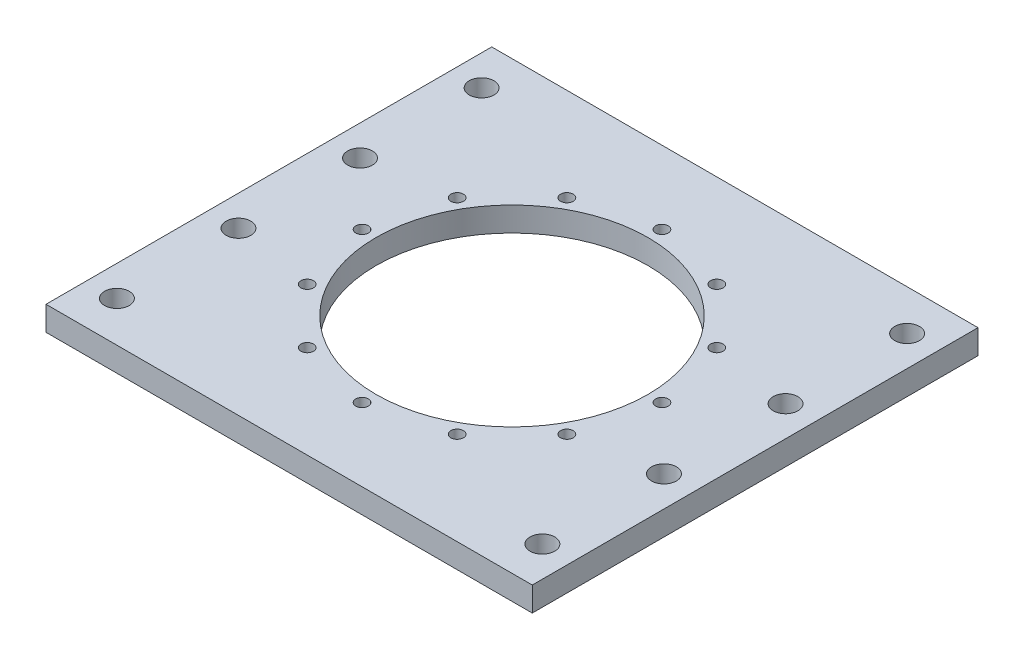
ISO-10303-21;
HEADER;
FILE_DESCRIPTION(('STEP AP214'),'2;1');
FILE_NAME('part.step','',(''),(''),'','','');
FILE_SCHEMA(('AUTOMOTIVE_DESIGN { 1 0 10303 214 1 1 1 1 }'));
ENDSEC;
DATA;
#1=APPLICATION_CONTEXT('core data for automotive mechanical design processes');
#2=APPLICATION_PROTOCOL_DEFINITION('international standard','automotive_design',2000,#1);
#3=PRODUCT_CONTEXT('',#1,'mechanical');
#4=PRODUCT('Part','Part','',(#3));
#5=PRODUCT_RELATED_PRODUCT_CATEGORY('part','',(#4));
#6=PRODUCT_DEFINITION_FORMATION('','',#4);
#7=PRODUCT_DEFINITION_CONTEXT('part definition',#1,'design');
#8=PRODUCT_DEFINITION('design','',#6,#7);
#9=PRODUCT_DEFINITION_SHAPE('','',#8);
#10=(LENGTH_UNIT() NAMED_UNIT(*) SI_UNIT(.MILLI.,.METRE.));
#11=(NAMED_UNIT(*) PLANE_ANGLE_UNIT() SI_UNIT($,.RADIAN.));
#12=(NAMED_UNIT(*) SI_UNIT($,.STERADIAN.) SOLID_ANGLE_UNIT());
#13=UNCERTAINTY_MEASURE_WITH_UNIT(LENGTH_MEASURE(1.E-05),#10,'distance_accuracy_value','');
#14=(GEOMETRIC_REPRESENTATION_CONTEXT(3) GLOBAL_UNCERTAINTY_ASSIGNED_CONTEXT((#13)) GLOBAL_UNIT_ASSIGNED_CONTEXT((#10,
#11,#12)) REPRESENTATION_CONTEXT('',''));
#15=CARTESIAN_POINT('',(0.,0.,0.));
#16=DIRECTION('',(0.,0.,1.));
#17=DIRECTION('',(1.,0.,0.));
#18=AXIS2_PLACEMENT_3D('',#15,#16,#17);
#19=CARTESIAN_POINT('',(60.,6.,-55.));
#20=DIRECTION('',(-1.,0.,0.));
#21=DIRECTION('',(0.,0.,1.));
#22=AXIS2_PLACEMENT_3D('',#19,#20,#21);
#23=PLANE('',#22);
#24=DIRECTION('',(0.,0.,-1.));
#25=VECTOR('',#24,1.);
#26=CARTESIAN_POINT('',(60.,0.,-55.));
#27=LINE('',#26,#25);
#28=CARTESIAN_POINT('',(60.,0.,55.));
#29=VERTEX_POINT('',#28);
#30=CARTESIAN_POINT('',(60.,0.,-55.));
#31=VERTEX_POINT('',#30);
#32=EDGE_CURVE('E104',#29,#31,#27,.T.);
#33=ORIENTED_EDGE('',*,*,#32,.T.);
#34=DIRECTION('',(0.,-1.,0.));
#35=VECTOR('',#34,1.);
#36=CARTESIAN_POINT('',(60.,6.,-55.));
#37=LINE('',#36,#35);
#38=CARTESIAN_POINT('',(60.,6.,-55.));
#39=VERTEX_POINT('',#38);
#40=EDGE_CURVE('E11',#39,#31,#37,.T.);
#41=ORIENTED_EDGE('',*,*,#40,.F.);
#42=DIRECTION('',(0.,0.,-1.));
#43=VECTOR('',#42,1.);
#44=CARTESIAN_POINT('',(60.,6.,-55.));
#45=LINE('',#44,#43);
#46=CARTESIAN_POINT('',(60.,6.,55.));
#47=VERTEX_POINT('',#46);
#48=EDGE_CURVE('E95',#47,#39,#45,.T.);
#49=ORIENTED_EDGE('',*,*,#48,.F.);
#50=DIRECTION('',(0.,-1.,0.));
#51=VECTOR('',#50,1.);
#52=CARTESIAN_POINT('',(60.,6.,55.));
#53=LINE('',#52,#51);
#54=EDGE_CURVE('E99',#47,#29,#53,.T.);
#55=ORIENTED_EDGE('',*,*,#54,.T.);
#56=EDGE_LOOP('',(#33,#41,#49,#55));
#57=FACE_BOUND('',#56,.T.);
#58=ADVANCED_FACE('F41',(#57),#23,.F.);
#59=CARTESIAN_POINT('',(-60.,6.,-55.));
#60=DIRECTION('',(0.,0.,1.));
#61=DIRECTION('',(1.,0.,0.));
#62=AXIS2_PLACEMENT_3D('',#59,#60,#61);
#63=PLANE('',#62);
#64=DIRECTION('',(-1.,0.,0.));
#65=VECTOR('',#64,1.);
#66=CARTESIAN_POINT('',(-60.,0.,-55.));
#67=LINE('',#66,#65);
#68=CARTESIAN_POINT('',(-60.,0.,-55.));
#69=VERTEX_POINT('',#68);
#70=EDGE_CURVE('E98',#31,#69,#67,.T.);
#71=ORIENTED_EDGE('',*,*,#70,.T.);
#72=DIRECTION('',(0.,-1.,0.));
#73=VECTOR('',#72,1.);
#74=CARTESIAN_POINT('',(-60.,6.,-55.));
#75=LINE('',#74,#73);
#76=CARTESIAN_POINT('',(-60.,6.,-55.));
#77=VERTEX_POINT('',#76);
#78=EDGE_CURVE('E47',#77,#69,#75,.T.);
#79=ORIENTED_EDGE('',*,*,#78,.F.);
#80=DIRECTION('',(-1.,0.,0.));
#81=VECTOR('',#80,1.);
#82=CARTESIAN_POINT('',(-60.,6.,-55.));
#83=LINE('',#82,#81);
#84=EDGE_CURVE('E90',#39,#77,#83,.T.);
#85=ORIENTED_EDGE('',*,*,#84,.F.);
#86=ORIENTED_EDGE('',*,*,#40,.T.);
#87=EDGE_LOOP('',(#71,#79,#85,#86));
#88=FACE_BOUND('',#87,.T.);
#89=ADVANCED_FACE('F91',(#88),#63,.F.);
#90=CARTESIAN_POINT('',(-60.,6.,-55.));
#91=DIRECTION('',(1.,0.,0.));
#92=DIRECTION('',(0.,0.,-1.));
#93=AXIS2_PLACEMENT_3D('',#90,#91,#92);
#94=PLANE('',#93);
#95=DIRECTION('',(0.,0.,1.));
#96=VECTOR('',#95,1.);
#97=CARTESIAN_POINT('',(-60.,0.,-55.));
#98=LINE('',#97,#96);
#99=CARTESIAN_POINT('',(-60.,0.,55.));
#100=VERTEX_POINT('',#99);
#101=EDGE_CURVE('E74',#69,#100,#98,.T.);
#102=ORIENTED_EDGE('',*,*,#101,.T.);
#103=DIRECTION('',(0.,-1.,0.));
#104=VECTOR('',#103,1.);
#105=CARTESIAN_POINT('',(-60.,6.,55.));
#106=LINE('',#105,#104);
#107=CARTESIAN_POINT('',(-60.,6.,55.));
#108=VERTEX_POINT('',#107);
#109=EDGE_CURVE('E97',#108,#100,#106,.T.);
#110=ORIENTED_EDGE('',*,*,#109,.F.);
#111=DIRECTION('',(0.,0.,1.));
#112=VECTOR('',#111,1.);
#113=CARTESIAN_POINT('',(-60.,6.,-55.));
#114=LINE('',#113,#112);
#115=EDGE_CURVE('E86',#77,#108,#114,.T.);
#116=ORIENTED_EDGE('',*,*,#115,.F.);
#117=ORIENTED_EDGE('',*,*,#78,.T.);
#118=EDGE_LOOP('',(#102,#110,#116,#117));
#119=FACE_BOUND('',#118,.T.);
#120=ADVANCED_FACE('F96',(#119),#94,.F.);
#121=CARTESIAN_POINT('',(-60.,6.,55.));
#122=DIRECTION('',(0.,0.,-1.));
#123=DIRECTION('',(-1.,0.,0.));
#124=AXIS2_PLACEMENT_3D('',#121,#122,#123);
#125=PLANE('',#124);
#126=DIRECTION('',(1.,0.,0.));
#127=VECTOR('',#126,1.);
#128=CARTESIAN_POINT('',(-60.,0.,55.));
#129=LINE('',#128,#127);
#130=EDGE_CURVE('E78',#100,#29,#129,.T.);
#131=ORIENTED_EDGE('',*,*,#130,.T.);
#132=ORIENTED_EDGE('',*,*,#54,.F.);
#133=DIRECTION('',(1.,0.,0.));
#134=VECTOR('',#133,1.);
#135=CARTESIAN_POINT('',(-60.,6.,55.));
#136=LINE('',#135,#134);
#137=EDGE_CURVE('E60',#108,#47,#136,.T.);
#138=ORIENTED_EDGE('',*,*,#137,.F.);
#139=ORIENTED_EDGE('',*,*,#109,.T.);
#140=EDGE_LOOP('',(#131,#132,#138,#139));
#141=FACE_BOUND('',#140,.T.);
#142=ADVANCED_FACE('F115',(#141),#125,.F.);
#143=CARTESIAN_POINT('',(0.,6.,0.));
#144=DIRECTION('',(0.,1.,0.));
#145=DIRECTION('',(0.,0.,1.));
#146=AXIS2_PLACEMENT_3D('',#143,#144,#145);
#147=PLANE('',#146);
#148=CARTESIAN_POINT('',(-52.5,6.,45.));
#149=DIRECTION('',(0.,1.,0.));
#150=DIRECTION('',(0.,0.,1.));
#151=AXIS2_PLACEMENT_3D('',#148,#149,#150);
#152=CIRCLE('',#151,3.05);
#153=CARTESIAN_POINT('',(-52.5,6.,48.05));
#154=VERTEX_POINT('',#153);
#155=EDGE_CURVE('E239',#154,#154,#152,.T.);
#156=ORIENTED_EDGE('',*,*,#155,.F.);
#157=EDGE_LOOP('',(#156));
#158=FACE_BOUND('',#157,.T.);
#159=CARTESIAN_POINT('',(-52.5,6.,15.));
#160=DIRECTION('',(0.,1.,0.));
#161=DIRECTION('',(0.,0.,1.));
#162=AXIS2_PLACEMENT_3D('',#159,#160,#161);
#163=CIRCLE('',#162,3.05);
#164=CARTESIAN_POINT('',(-52.5,6.,18.05));
#165=VERTEX_POINT('',#164);
#166=EDGE_CURVE('E234',#165,#165,#163,.T.);
#167=ORIENTED_EDGE('',*,*,#166,.F.);
#168=EDGE_LOOP('',(#167));
#169=FACE_BOUND('',#168,.T.);
#170=CARTESIAN_POINT('',(-52.5,6.,-15.));
#171=DIRECTION('',(0.,1.,0.));
#172=DIRECTION('',(0.,0.,1.));
#173=AXIS2_PLACEMENT_3D('',#170,#171,#172);
#174=CIRCLE('',#173,3.05);
#175=CARTESIAN_POINT('',(-52.5,6.,-11.95));
#176=VERTEX_POINT('',#175);
#177=EDGE_CURVE('E226',#176,#176,#174,.T.);
#178=ORIENTED_EDGE('',*,*,#177,.F.);
#179=EDGE_LOOP('',(#178));
#180=FACE_BOUND('',#179,.T.);
#181=CARTESIAN_POINT('',(-52.5,6.,-45.));
#182=DIRECTION('',(0.,1.,0.));
#183=DIRECTION('',(0.,0.,1.));
#184=AXIS2_PLACEMENT_3D('',#181,#182,#183);
#185=CIRCLE('',#184,3.05);
#186=CARTESIAN_POINT('',(-52.5,6.,-41.95));
#187=VERTEX_POINT('',#186);
#188=EDGE_CURVE('E225',#187,#187,#185,.T.);
#189=ORIENTED_EDGE('',*,*,#188,.F.);
#190=EDGE_LOOP('',(#189));
#191=FACE_BOUND('',#190,.T.);
#192=CARTESIAN_POINT('',(52.5,6.,45.));
#193=DIRECTION('',(0.,1.,0.));
#194=DIRECTION('',(0.,0.,1.));
#195=AXIS2_PLACEMENT_3D('',#192,#193,#194);
#196=CIRCLE('',#195,3.05);
#197=CARTESIAN_POINT('',(52.5,6.,48.05));
#198=VERTEX_POINT('',#197);
#199=EDGE_CURVE('E217',#198,#198,#196,.T.);
#200=ORIENTED_EDGE('',*,*,#199,.F.);
#201=EDGE_LOOP('',(#200));
#202=FACE_BOUND('',#201,.T.);
#203=CARTESIAN_POINT('',(52.5,6.,15.));
#204=DIRECTION('',(0.,1.,0.));
#205=DIRECTION('',(0.,0.,1.));
#206=AXIS2_PLACEMENT_3D('',#203,#204,#205);
#207=CIRCLE('',#206,3.05);
#208=CARTESIAN_POINT('',(52.5,6.,18.05));
#209=VERTEX_POINT('',#208);
#210=EDGE_CURVE('E208',#209,#209,#207,.T.);
#211=ORIENTED_EDGE('',*,*,#210,.F.);
#212=EDGE_LOOP('',(#211));
#213=FACE_BOUND('',#212,.T.);
#214=CARTESIAN_POINT('',(52.5,6.,-15.));
#215=DIRECTION('',(0.,1.,0.));
#216=DIRECTION('',(0.,0.,1.));
#217=AXIS2_PLACEMENT_3D('',#214,#215,#216);
#218=CIRCLE('',#217,3.05);
#219=CARTESIAN_POINT('',(52.5,6.,-11.95));
#220=VERTEX_POINT('',#219);
#221=EDGE_CURVE('E204',#220,#220,#218,.T.);
#222=ORIENTED_EDGE('',*,*,#221,.F.);
#223=EDGE_LOOP('',(#222));
#224=FACE_BOUND('',#223,.T.);
#225=CARTESIAN_POINT('',(52.5,6.,-45.));
#226=DIRECTION('',(0.,1.,0.));
#227=DIRECTION('',(0.,0.,1.));
#228=AXIS2_PLACEMENT_3D('',#225,#226,#227);
#229=CIRCLE('',#228,3.05);
#230=CARTESIAN_POINT('',(52.5,6.,-41.95));
#231=VERTEX_POINT('',#230);
#232=EDGE_CURVE('E198',#231,#231,#229,.T.);
#233=ORIENTED_EDGE('',*,*,#232,.F.);
#234=EDGE_LOOP('',(#233));
#235=FACE_BOUND('',#234,.T.);
#236=CARTESIAN_POINT('',(18.4999999999996,6.,-32.0429399400245));
#237=DIRECTION('',(0.,1.,0.));
#238=DIRECTION('',(0.,0.,1.));
#239=AXIS2_PLACEMENT_3D('',#236,#237,#238);
#240=CIRCLE('',#239,1.55);
#241=CARTESIAN_POINT('',(18.4999999999996,6.,-30.4929399400245));
#242=VERTEX_POINT('',#241);
#243=EDGE_CURVE('E191',#242,#242,#240,.T.);
#244=ORIENTED_EDGE('',*,*,#243,.F.);
#245=EDGE_LOOP('',(#244));
#246=FACE_BOUND('',#245,.T.);
#247=CARTESIAN_POINT('',(32.042939940024,6.,-18.5000000000004));
#248=DIRECTION('',(0.,1.,0.));
#249=DIRECTION('',(0.,0.,1.));
#250=AXIS2_PLACEMENT_3D('',#247,#248,#249);
#251=CIRCLE('',#250,1.55);
#252=CARTESIAN_POINT('',(32.042939940024,6.,-16.9500000000004));
#253=VERTEX_POINT('',#252);
#254=EDGE_CURVE('E187',#253,#253,#251,.T.);
#255=ORIENTED_EDGE('',*,*,#254,.F.);
#256=EDGE_LOOP('',(#255));
#257=FACE_BOUND('',#256,.T.);
#258=CARTESIAN_POINT('',(37.,6.,-3.87554428611588E-13));
#259=DIRECTION('',(0.,1.,0.));
#260=DIRECTION('',(0.,0.,1.));
#261=AXIS2_PLACEMENT_3D('',#258,#259,#260);
#262=CIRCLE('',#261,1.55);
#263=CARTESIAN_POINT('',(37.,6.,1.54999999999962));
#264=VERTEX_POINT('',#263);
#265=EDGE_CURVE('E179',#264,#264,#262,.T.);
#266=ORIENTED_EDGE('',*,*,#265,.F.);
#267=EDGE_LOOP('',(#266));
#268=FACE_BOUND('',#267,.T.);
#269=CARTESIAN_POINT('',(32.0429399400244,6.,18.4999999999997));
#270=DIRECTION('',(0.,1.,0.));
#271=DIRECTION('',(0.,0.,1.));
#272=AXIS2_PLACEMENT_3D('',#269,#270,#271);
#273=CIRCLE('',#272,1.55);
#274=CARTESIAN_POINT('',(32.0429399400244,6.,20.0499999999997));
#275=VERTEX_POINT('',#274);
#276=EDGE_CURVE('E172',#275,#275,#273,.T.);
#277=ORIENTED_EDGE('',*,*,#276,.F.);
#278=EDGE_LOOP('',(#277));
#279=FACE_BOUND('',#278,.T.);
#280=CARTESIAN_POINT('',(18.5000000000003,6.,32.0429399400241));
#281=DIRECTION('',(0.,1.,0.));
#282=DIRECTION('',(0.,0.,1.));
#283=AXIS2_PLACEMENT_3D('',#280,#281,#282);
#284=CIRCLE('',#283,1.55);
#285=CARTESIAN_POINT('',(18.5000000000003,6.,33.5929399400241));
#286=VERTEX_POINT('',#285);
#287=EDGE_CURVE('E166',#286,#286,#284,.T.);
#288=ORIENTED_EDGE('',*,*,#287,.F.);
#289=EDGE_LOOP('',(#288));
#290=FACE_BOUND('',#289,.T.);
#291=CARTESIAN_POINT('',(0.,6.,37.));
#292=DIRECTION('',(0.,1.,0.));
#293=DIRECTION('',(0.,0.,1.));
#294=AXIS2_PLACEMENT_3D('',#291,#292,#293);
#295=CIRCLE('',#294,1.55);
#296=CARTESIAN_POINT('',(0.,6.,38.55));
#297=VERTEX_POINT('',#296);
#298=EDGE_CURVE('E162',#297,#297,#295,.T.);
#299=ORIENTED_EDGE('',*,*,#298,.F.);
#300=EDGE_LOOP('',(#299));
#301=FACE_BOUND('',#300,.T.);
#302=CARTESIAN_POINT('',(-18.4999999999998,6.,32.0429399400243));
#303=DIRECTION('',(0.,1.,0.));
#304=DIRECTION('',(0.,0.,1.));
#305=AXIS2_PLACEMENT_3D('',#302,#303,#304);
#306=CIRCLE('',#305,1.55);
#307=CARTESIAN_POINT('',(-18.4999999999998,6.,33.5929399400243));
#308=VERTEX_POINT('',#307);
#309=EDGE_CURVE('E157',#308,#308,#306,.T.);
#310=ORIENTED_EDGE('',*,*,#309,.F.);
#311=EDGE_LOOP('',(#310));
#312=FACE_BOUND('',#311,.T.);
#313=CARTESIAN_POINT('',(-32.0429399400241,6.,18.5000000000002));
#314=DIRECTION('',(0.,1.,0.));
#315=DIRECTION('',(0.,0.,1.));
#316=AXIS2_PLACEMENT_3D('',#313,#314,#315);
#317=CIRCLE('',#316,1.55);
#318=CARTESIAN_POINT('',(-32.0429399400241,6.,20.0500000000001));
#319=VERTEX_POINT('',#318);
#320=EDGE_CURVE('E147',#319,#319,#317,.T.);
#321=ORIENTED_EDGE('',*,*,#320,.F.);
#322=EDGE_LOOP('',(#321));
#323=FACE_BOUND('',#322,.T.);
#324=CARTESIAN_POINT('',(-37.,6.,1.29184809537196E-13));
#325=DIRECTION('',(0.,1.,0.));
#326=DIRECTION('',(0.,0.,1.));
#327=AXIS2_PLACEMENT_3D('',#324,#325,#326);
#328=CIRCLE('',#327,1.55);
#329=CARTESIAN_POINT('',(-37.,6.,1.55000000000013));
#330=VERTEX_POINT('',#329);
#331=EDGE_CURVE('E144',#330,#330,#328,.T.);
#332=ORIENTED_EDGE('',*,*,#331,.F.);
#333=EDGE_LOOP('',(#332));
#334=FACE_BOUND('',#333,.T.);
#335=CARTESIAN_POINT('',(-32.0429399400243,6.,-18.4999999999999));
#336=DIRECTION('',(0.,1.,0.));
#337=DIRECTION('',(0.,0.,1.));
#338=AXIS2_PLACEMENT_3D('',#335,#336,#337);
#339=CIRCLE('',#338,1.55);
#340=CARTESIAN_POINT('',(-32.0429399400243,6.,-16.9499999999999));
#341=VERTEX_POINT('',#340);
#342=EDGE_CURVE('E138',#341,#341,#339,.T.);
#343=ORIENTED_EDGE('',*,*,#342,.F.);
#344=EDGE_LOOP('',(#343));
#345=FACE_BOUND('',#344,.T.);
#346=CARTESIAN_POINT('',(-18.5,6.,-32.0429399400242));
#347=DIRECTION('',(0.,1.,0.));
#348=DIRECTION('',(0.,0.,1.));
#349=AXIS2_PLACEMENT_3D('',#346,#347,#348);
#350=CIRCLE('',#349,1.55);
#351=CARTESIAN_POINT('',(-18.5,6.,-30.4929399400242));
#352=VERTEX_POINT('',#351);
#353=EDGE_CURVE('E135',#352,#352,#350,.T.);
#354=ORIENTED_EDGE('',*,*,#353,.F.);
#355=EDGE_LOOP('',(#354));
#356=FACE_BOUND('',#355,.T.);
#357=CARTESIAN_POINT('',(0.,6.,-37.));
#358=DIRECTION('',(0.,1.,0.));
#359=DIRECTION('',(0.,0.,1.));
#360=AXIS2_PLACEMENT_3D('',#357,#358,#359);
#361=CIRCLE('',#360,1.55);
#362=CARTESIAN_POINT('',(0.,6.,-35.45));
#363=VERTEX_POINT('',#362);
#364=EDGE_CURVE('E129',#363,#363,#361,.T.);
#365=ORIENTED_EDGE('',*,*,#364,.F.);
#366=EDGE_LOOP('',(#365));
#367=FACE_BOUND('',#366,.T.);
#368=CARTESIAN_POINT('',(0.,6.,0.));
#369=DIRECTION('',(0.,1.,0.));
#370=DIRECTION('',(0.,0.,1.));
#371=AXIS2_PLACEMENT_3D('',#368,#369,#370);
#372=CIRCLE('',#371,33.55);
#373=CARTESIAN_POINT('',(0.,6.,33.55));
#374=VERTEX_POINT('',#373);
#375=EDGE_CURVE('E117',#374,#374,#372,.T.);
#376=ORIENTED_EDGE('',*,*,#375,.F.);
#377=EDGE_LOOP('',(#376));
#378=FACE_BOUND('',#377,.T.);
#379=ORIENTED_EDGE('',*,*,#48,.T.);
#380=ORIENTED_EDGE('',*,*,#84,.T.);
#381=ORIENTED_EDGE('',*,*,#115,.T.);
#382=ORIENTED_EDGE('',*,*,#137,.T.);
#383=EDGE_LOOP('',(#379,#380,#381,#382));
#384=FACE_BOUND('',#383,.T.);
#385=ADVANCED_FACE('F88',(#158,#169,#180,#191,#202,#213,#224,#235,#246,#257,#268,#279,#290,#301,
#312,#323,#334,#345,#356,#367,#378,#384),#147,.T.);
#386=CARTESIAN_POINT('',(0.,0.,0.));
#387=DIRECTION('',(0.,1.,0.));
#388=DIRECTION('',(0.,0.,1.));
#389=AXIS2_PLACEMENT_3D('',#386,#387,#388);
#390=PLANE('',#389);
#391=CARTESIAN_POINT('',(-52.5,0.,45.));
#392=DIRECTION('',(0.,1.,0.));
#393=DIRECTION('',(0.,0.,1.));
#394=AXIS2_PLACEMENT_3D('',#391,#392,#393);
#395=CIRCLE('',#394,3.05);
#396=CARTESIAN_POINT('',(-52.5,0.,48.05));
#397=VERTEX_POINT('',#396);
#398=EDGE_CURVE('E240',#397,#397,#395,.T.);
#399=ORIENTED_EDGE('',*,*,#398,.T.);
#400=EDGE_LOOP('',(#399));
#401=FACE_BOUND('',#400,.T.);
#402=CARTESIAN_POINT('',(-52.5,0.,15.));
#403=DIRECTION('',(0.,1.,0.));
#404=DIRECTION('',(0.,0.,1.));
#405=AXIS2_PLACEMENT_3D('',#402,#403,#404);
#406=CIRCLE('',#405,3.05);
#407=CARTESIAN_POINT('',(-52.5,0.,18.05));
#408=VERTEX_POINT('',#407);
#409=EDGE_CURVE('E233',#408,#408,#406,.T.);
#410=ORIENTED_EDGE('',*,*,#409,.T.);
#411=EDGE_LOOP('',(#410));
#412=FACE_BOUND('',#411,.T.);
#413=CARTESIAN_POINT('',(-52.5,0.,-15.));
#414=DIRECTION('',(0.,1.,0.));
#415=DIRECTION('',(0.,0.,1.));
#416=AXIS2_PLACEMENT_3D('',#413,#414,#415);
#417=CIRCLE('',#416,3.05);
#418=CARTESIAN_POINT('',(-52.5,0.,-11.95));
#419=VERTEX_POINT('',#418);
#420=EDGE_CURVE('E221',#419,#419,#417,.T.);
#421=ORIENTED_EDGE('',*,*,#420,.T.);
#422=EDGE_LOOP('',(#421));
#423=FACE_BOUND('',#422,.T.);
#424=CARTESIAN_POINT('',(-52.5,0.,-45.));
#425=DIRECTION('',(0.,1.,0.));
#426=DIRECTION('',(0.,0.,1.));
#427=AXIS2_PLACEMENT_3D('',#424,#425,#426);
#428=CIRCLE('',#427,3.05);
#429=CARTESIAN_POINT('',(-52.5,0.,-41.95));
#430=VERTEX_POINT('',#429);
#431=EDGE_CURVE('E219',#430,#430,#428,.T.);
#432=ORIENTED_EDGE('',*,*,#431,.T.);
#433=EDGE_LOOP('',(#432));
#434=FACE_BOUND('',#433,.T.);
#435=CARTESIAN_POINT('',(52.5,0.,45.));
#436=DIRECTION('',(0.,1.,0.));
#437=DIRECTION('',(0.,0.,1.));
#438=AXIS2_PLACEMENT_3D('',#435,#436,#437);
#439=CIRCLE('',#438,3.05);
#440=CARTESIAN_POINT('',(52.5,0.,48.05));
#441=VERTEX_POINT('',#440);
#442=EDGE_CURVE('E215',#441,#441,#439,.T.);
#443=ORIENTED_EDGE('',*,*,#442,.T.);
#444=EDGE_LOOP('',(#443));
#445=FACE_BOUND('',#444,.T.);
#446=CARTESIAN_POINT('',(52.5,0.,15.));
#447=DIRECTION('',(0.,1.,0.));
#448=DIRECTION('',(0.,0.,1.));
#449=AXIS2_PLACEMENT_3D('',#446,#447,#448);
#450=CIRCLE('',#449,3.05);
#451=CARTESIAN_POINT('',(52.5,0.,18.05));
#452=VERTEX_POINT('',#451);
#453=EDGE_CURVE('E210',#452,#452,#450,.T.);
#454=ORIENTED_EDGE('',*,*,#453,.T.);
#455=EDGE_LOOP('',(#454));
#456=FACE_BOUND('',#455,.T.);
#457=CARTESIAN_POINT('',(52.5,0.,-15.));
#458=DIRECTION('',(0.,1.,0.));
#459=DIRECTION('',(0.,0.,1.));
#460=AXIS2_PLACEMENT_3D('',#457,#458,#459);
#461=CIRCLE('',#460,3.05);
#462=CARTESIAN_POINT('',(52.5,0.,-11.95));
#463=VERTEX_POINT('',#462);
#464=EDGE_CURVE('E202',#463,#463,#461,.T.);
#465=ORIENTED_EDGE('',*,*,#464,.T.);
#466=EDGE_LOOP('',(#465));
#467=FACE_BOUND('',#466,.T.);
#468=CARTESIAN_POINT('',(52.5,0.,-45.));
#469=DIRECTION('',(0.,1.,0.));
#470=DIRECTION('',(0.,0.,1.));
#471=AXIS2_PLACEMENT_3D('',#468,#469,#470);
#472=CIRCLE('',#471,3.05);
#473=CARTESIAN_POINT('',(52.5,0.,-41.95));
#474=VERTEX_POINT('',#473);
#475=EDGE_CURVE('E192',#474,#474,#472,.T.);
#476=ORIENTED_EDGE('',*,*,#475,.T.);
#477=EDGE_LOOP('',(#476));
#478=FACE_BOUND('',#477,.T.);
#479=CARTESIAN_POINT('',(18.4999999999996,0.,-32.0429399400245));
#480=DIRECTION('',(0.,1.,0.));
#481=DIRECTION('',(0.,0.,1.));
#482=AXIS2_PLACEMENT_3D('',#479,#480,#481);
#483=CIRCLE('',#482,1.55);
#484=CARTESIAN_POINT('',(18.4999999999996,0.,-30.4929399400245));
#485=VERTEX_POINT('',#484);
#486=EDGE_CURVE('E186',#485,#485,#483,.T.);
#487=ORIENTED_EDGE('',*,*,#486,.T.);
#488=EDGE_LOOP('',(#487));
#489=FACE_BOUND('',#488,.T.);
#490=CARTESIAN_POINT('',(32.042939940024,0.,-18.5000000000004));
#491=DIRECTION('',(0.,1.,0.));
#492=DIRECTION('',(0.,0.,1.));
#493=AXIS2_PLACEMENT_3D('',#490,#491,#492);
#494=CIRCLE('',#493,1.55);
#495=CARTESIAN_POINT('',(32.042939940024,0.,-16.9500000000004));
#496=VERTEX_POINT('',#495);
#497=EDGE_CURVE('E182',#496,#496,#494,.T.);
#498=ORIENTED_EDGE('',*,*,#497,.T.);
#499=EDGE_LOOP('',(#498));
#500=FACE_BOUND('',#499,.T.);
#501=CARTESIAN_POINT('',(37.,0.,-3.87554428611588E-13));
#502=DIRECTION('',(0.,1.,0.));
#503=DIRECTION('',(0.,0.,1.));
#504=AXIS2_PLACEMENT_3D('',#501,#502,#503);
#505=CIRCLE('',#504,1.55);
#506=CARTESIAN_POINT('',(37.,0.,1.54999999999961));
#507=VERTEX_POINT('',#506);
#508=EDGE_CURVE('E180',#507,#507,#505,.T.);
#509=ORIENTED_EDGE('',*,*,#508,.T.);
#510=EDGE_LOOP('',(#509));
#511=FACE_BOUND('',#510,.T.);
#512=CARTESIAN_POINT('',(32.0429399400244,0.,18.4999999999997));
#513=DIRECTION('',(0.,1.,0.));
#514=DIRECTION('',(0.,0.,1.));
#515=AXIS2_PLACEMENT_3D('',#512,#513,#514);
#516=CIRCLE('',#515,1.55);
#517=CARTESIAN_POINT('',(32.0429399400244,0.,20.0499999999997));
#518=VERTEX_POINT('',#517);
#519=EDGE_CURVE('E171',#518,#518,#516,.T.);
#520=ORIENTED_EDGE('',*,*,#519,.T.);
#521=EDGE_LOOP('',(#520));
#522=FACE_BOUND('',#521,.T.);
#523=CARTESIAN_POINT('',(18.5000000000003,0.,32.0429399400241));
#524=DIRECTION('',(0.,1.,0.));
#525=DIRECTION('',(0.,0.,1.));
#526=AXIS2_PLACEMENT_3D('',#523,#524,#525);
#527=CIRCLE('',#526,1.55);
#528=CARTESIAN_POINT('',(18.5000000000003,0.,33.5929399400241));
#529=VERTEX_POINT('',#528);
#530=EDGE_CURVE('E164',#529,#529,#527,.T.);
#531=ORIENTED_EDGE('',*,*,#530,.T.);
#532=EDGE_LOOP('',(#531));
#533=FACE_BOUND('',#532,.T.);
#534=CARTESIAN_POINT('',(0.,0.,37.));
#535=DIRECTION('',(0.,1.,0.));
#536=DIRECTION('',(0.,0.,1.));
#537=AXIS2_PLACEMENT_3D('',#534,#535,#536);
#538=CIRCLE('',#537,1.55);
#539=CARTESIAN_POINT('',(0.,0.,38.55));
#540=VERTEX_POINT('',#539);
#541=EDGE_CURVE('E159',#540,#540,#538,.T.);
#542=ORIENTED_EDGE('',*,*,#541,.T.);
#543=EDGE_LOOP('',(#542));
#544=FACE_BOUND('',#543,.T.);
#545=CARTESIAN_POINT('',(-18.4999999999998,0.,32.0429399400243));
#546=DIRECTION('',(0.,1.,0.));
#547=DIRECTION('',(0.,0.,1.));
#548=AXIS2_PLACEMENT_3D('',#545,#546,#547);
#549=CIRCLE('',#548,1.55);
#550=CARTESIAN_POINT('',(-18.4999999999998,0.,33.5929399400243));
#551=VERTEX_POINT('',#550);
#552=EDGE_CURVE('E153',#551,#551,#549,.T.);
#553=ORIENTED_EDGE('',*,*,#552,.T.);
#554=EDGE_LOOP('',(#553));
#555=FACE_BOUND('',#554,.T.);
#556=CARTESIAN_POINT('',(-32.0429399400241,0.,18.5000000000002));
#557=DIRECTION('',(0.,1.,0.));
#558=DIRECTION('',(0.,0.,1.));
#559=AXIS2_PLACEMENT_3D('',#556,#557,#558);
#560=CIRCLE('',#559,1.55);
#561=CARTESIAN_POINT('',(-32.0429399400241,0.,20.0500000000001));
#562=VERTEX_POINT('',#561);
#563=EDGE_CURVE('E146',#562,#562,#560,.T.);
#564=ORIENTED_EDGE('',*,*,#563,.T.);
#565=EDGE_LOOP('',(#564));
#566=FACE_BOUND('',#565,.T.);
#567=CARTESIAN_POINT('',(-37.,0.,1.29184809537196E-13));
#568=DIRECTION('',(0.,1.,0.));
#569=DIRECTION('',(0.,0.,1.));
#570=AXIS2_PLACEMENT_3D('',#567,#568,#569);
#571=CIRCLE('',#570,1.55);
#572=CARTESIAN_POINT('',(-37.,0.,1.55000000000013));
#573=VERTEX_POINT('',#572);
#574=EDGE_CURVE('E142',#573,#573,#571,.T.);
#575=ORIENTED_EDGE('',*,*,#574,.T.);
#576=EDGE_LOOP('',(#575));
#577=FACE_BOUND('',#576,.T.);
#578=CARTESIAN_POINT('',(-32.0429399400243,0.,-18.4999999999999));
#579=DIRECTION('',(0.,1.,0.));
#580=DIRECTION('',(0.,0.,1.));
#581=AXIS2_PLACEMENT_3D('',#578,#579,#580);
#582=CIRCLE('',#581,1.55);
#583=CARTESIAN_POINT('',(-32.0429399400243,0.,-16.9499999999999));
#584=VERTEX_POINT('',#583);
#585=EDGE_CURVE('E131',#584,#584,#582,.T.);
#586=ORIENTED_EDGE('',*,*,#585,.T.);
#587=EDGE_LOOP('',(#586));
#588=FACE_BOUND('',#587,.T.);
#589=CARTESIAN_POINT('',(-18.5,0.,-32.0429399400242));
#590=DIRECTION('',(0.,1.,0.));
#591=DIRECTION('',(0.,0.,1.));
#592=AXIS2_PLACEMENT_3D('',#589,#590,#591);
#593=CIRCLE('',#592,1.55);
#594=CARTESIAN_POINT('',(-18.5,0.,-30.4929399400242));
#595=VERTEX_POINT('',#594);
#596=EDGE_CURVE('E128',#595,#595,#593,.T.);
#597=ORIENTED_EDGE('',*,*,#596,.T.);
#598=EDGE_LOOP('',(#597));
#599=FACE_BOUND('',#598,.T.);
#600=CARTESIAN_POINT('',(0.,0.,-37.));
#601=DIRECTION('',(0.,1.,0.));
#602=DIRECTION('',(0.,0.,1.));
#603=AXIS2_PLACEMENT_3D('',#600,#601,#602);
#604=CIRCLE('',#603,1.55);
#605=CARTESIAN_POINT('',(0.,0.,-35.45));
#606=VERTEX_POINT('',#605);
#607=EDGE_CURVE('E122',#606,#606,#604,.T.);
#608=ORIENTED_EDGE('',*,*,#607,.T.);
#609=EDGE_LOOP('',(#608));
#610=FACE_BOUND('',#609,.T.);
#611=CARTESIAN_POINT('',(0.,0.,0.));
#612=DIRECTION('',(0.,1.,0.));
#613=DIRECTION('',(0.,0.,1.));
#614=AXIS2_PLACEMENT_3D('',#611,#612,#613);
#615=CIRCLE('',#614,33.55);
#616=CARTESIAN_POINT('',(0.,0.,33.55));
#617=VERTEX_POINT('',#616);
#618=EDGE_CURVE('E110',#617,#617,#615,.T.);
#619=ORIENTED_EDGE('',*,*,#618,.T.);
#620=EDGE_LOOP('',(#619));
#621=FACE_BOUND('',#620,.T.);
#622=ORIENTED_EDGE('',*,*,#32,.F.);
#623=ORIENTED_EDGE('',*,*,#130,.F.);
#624=ORIENTED_EDGE('',*,*,#101,.F.);
#625=ORIENTED_EDGE('',*,*,#70,.F.);
#626=EDGE_LOOP('',(#622,#623,#624,#625));
#627=FACE_BOUND('',#626,.T.);
#628=ADVANCED_FACE('F114',(#401,#412,#423,#434,#445,#456,#467,#478,#489,#500,#511,#522,#533,
#544,#555,#566,#577,#588,#599,#610,#621,#627),#390,.F.);
#629=CARTESIAN_POINT('',(0.,0.,0.));
#630=DIRECTION('',(0.,1.,0.));
#631=DIRECTION('',(0.,0.,1.));
#632=AXIS2_PLACEMENT_3D('',#629,#630,#631);
#633=CYLINDRICAL_SURFACE('',#632,33.55);
#634=ORIENTED_EDGE('',*,*,#618,.F.);
#635=EDGE_LOOP('',(#634));
#636=FACE_BOUND('',#635,.T.);
#637=ORIENTED_EDGE('',*,*,#375,.T.);
#638=EDGE_LOOP('',(#637));
#639=FACE_BOUND('',#638,.T.);
#640=ADVANCED_FACE('F289',(#636,#639),#633,.F.);
#641=CARTESIAN_POINT('',(0.,6.,-37.));
#642=DIRECTION('',(0.,1.,0.));
#643=DIRECTION('',(0.,0.,1.));
#644=AXIS2_PLACEMENT_3D('',#641,#642,#643);
#645=CYLINDRICAL_SURFACE('',#644,1.55);
#646=ORIENTED_EDGE('',*,*,#607,.F.);
#647=EDGE_LOOP('',(#646));
#648=FACE_BOUND('',#647,.T.);
#649=ORIENTED_EDGE('',*,*,#364,.T.);
#650=EDGE_LOOP('',(#649));
#651=FACE_BOUND('',#650,.T.);
#652=ADVANCED_FACE('F293',(#648,#651),#645,.F.);
#653=CARTESIAN_POINT('',(-18.5,6.,-32.0429399400242));
#654=DIRECTION('',(0.,1.,0.));
#655=DIRECTION('',(0.,0.,1.));
#656=AXIS2_PLACEMENT_3D('',#653,#654,#655);
#657=CYLINDRICAL_SURFACE('',#656,1.55);
#658=ORIENTED_EDGE('',*,*,#596,.F.);
#659=EDGE_LOOP('',(#658));
#660=FACE_BOUND('',#659,.T.);
#661=ORIENTED_EDGE('',*,*,#353,.T.);
#662=EDGE_LOOP('',(#661));
#663=FACE_BOUND('',#662,.T.);
#664=ADVANCED_FACE('F296',(#660,#663),#657,.F.);
#665=CARTESIAN_POINT('',(-32.0429399400243,6.,-18.4999999999999));
#666=DIRECTION('',(0.,1.,0.));
#667=DIRECTION('',(0.,0.,1.));
#668=AXIS2_PLACEMENT_3D('',#665,#666,#667);
#669=CYLINDRICAL_SURFACE('',#668,1.55);
#670=ORIENTED_EDGE('',*,*,#585,.F.);
#671=EDGE_LOOP('',(#670));
#672=FACE_BOUND('',#671,.T.);
#673=ORIENTED_EDGE('',*,*,#342,.T.);
#674=EDGE_LOOP('',(#673));
#675=FACE_BOUND('',#674,.T.);
#676=ADVANCED_FACE('F356',(#672,#675),#669,.F.);
#677=CARTESIAN_POINT('',(-37.,6.,1.29184809537196E-13));
#678=DIRECTION('',(0.,1.,0.));
#679=DIRECTION('',(0.,0.,1.));
#680=AXIS2_PLACEMENT_3D('',#677,#678,#679);
#681=CYLINDRICAL_SURFACE('',#680,1.55);
#682=ORIENTED_EDGE('',*,*,#574,.F.);
#683=EDGE_LOOP('',(#682));
#684=FACE_BOUND('',#683,.T.);
#685=ORIENTED_EDGE('',*,*,#331,.T.);
#686=EDGE_LOOP('',(#685));
#687=FACE_BOUND('',#686,.T.);
#688=ADVANCED_FACE('F370',(#684,#687),#681,.F.);
#689=CARTESIAN_POINT('',(-32.0429399400241,6.,18.5000000000002));
#690=DIRECTION('',(0.,1.,0.));
#691=DIRECTION('',(0.,0.,1.));
#692=AXIS2_PLACEMENT_3D('',#689,#690,#691);
#693=CYLINDRICAL_SURFACE('',#692,1.55);
#694=ORIENTED_EDGE('',*,*,#563,.F.);
#695=EDGE_LOOP('',(#694));
#696=FACE_BOUND('',#695,.T.);
#697=ORIENTED_EDGE('',*,*,#320,.T.);
#698=EDGE_LOOP('',(#697));
#699=FACE_BOUND('',#698,.T.);
#700=ADVANCED_FACE('F376',(#696,#699),#693,.F.);
#701=CARTESIAN_POINT('',(-18.4999999999998,6.,32.0429399400243));
#702=DIRECTION('',(0.,1.,0.));
#703=DIRECTION('',(0.,0.,1.));
#704=AXIS2_PLACEMENT_3D('',#701,#702,#703);
#705=CYLINDRICAL_SURFACE('',#704,1.55);
#706=ORIENTED_EDGE('',*,*,#552,.F.);
#707=EDGE_LOOP('',(#706));
#708=FACE_BOUND('',#707,.T.);
#709=ORIENTED_EDGE('',*,*,#309,.T.);
#710=EDGE_LOOP('',(#709));
#711=FACE_BOUND('',#710,.T.);
#712=ADVANCED_FACE('F383',(#708,#711),#705,.F.);
#713=CARTESIAN_POINT('',(0.,6.,37.));
#714=DIRECTION('',(0.,1.,0.));
#715=DIRECTION('',(0.,0.,1.));
#716=AXIS2_PLACEMENT_3D('',#713,#714,#715);
#717=CYLINDRICAL_SURFACE('',#716,1.55);
#718=ORIENTED_EDGE('',*,*,#541,.F.);
#719=EDGE_LOOP('',(#718));
#720=FACE_BOUND('',#719,.T.);
#721=ORIENTED_EDGE('',*,*,#298,.T.);
#722=EDGE_LOOP('',(#721));
#723=FACE_BOUND('',#722,.T.);
#724=ADVANCED_FACE('F394',(#720,#723),#717,.F.);
#725=CARTESIAN_POINT('',(18.5000000000003,6.,32.0429399400241));
#726=DIRECTION('',(0.,1.,0.));
#727=DIRECTION('',(0.,0.,1.));
#728=AXIS2_PLACEMENT_3D('',#725,#726,#727);
#729=CYLINDRICAL_SURFACE('',#728,1.55);
#730=ORIENTED_EDGE('',*,*,#530,.F.);
#731=EDGE_LOOP('',(#730));
#732=FACE_BOUND('',#731,.T.);
#733=ORIENTED_EDGE('',*,*,#287,.T.);
#734=EDGE_LOOP('',(#733));
#735=FACE_BOUND('',#734,.T.);
#736=ADVANCED_FACE('F401',(#732,#735),#729,.F.);
#737=CARTESIAN_POINT('',(32.0429399400244,6.,18.4999999999997));
#738=DIRECTION('',(0.,1.,0.));
#739=DIRECTION('',(0.,0.,1.));
#740=AXIS2_PLACEMENT_3D('',#737,#738,#739);
#741=CYLINDRICAL_SURFACE('',#740,1.55);
#742=ORIENTED_EDGE('',*,*,#519,.F.);
#743=EDGE_LOOP('',(#742));
#744=FACE_BOUND('',#743,.T.);
#745=ORIENTED_EDGE('',*,*,#276,.T.);
#746=EDGE_LOOP('',(#745));
#747=FACE_BOUND('',#746,.T.);
#748=ADVANCED_FACE('F415',(#744,#747),#741,.F.);
#749=CARTESIAN_POINT('',(37.,6.,-3.87554428611588E-13));
#750=DIRECTION('',(0.,1.,0.));
#751=DIRECTION('',(0.,0.,1.));
#752=AXIS2_PLACEMENT_3D('',#749,#750,#751);
#753=CYLINDRICAL_SURFACE('',#752,1.55);
#754=ORIENTED_EDGE('',*,*,#508,.F.);
#755=EDGE_LOOP('',(#754));
#756=FACE_BOUND('',#755,.T.);
#757=ORIENTED_EDGE('',*,*,#265,.T.);
#758=EDGE_LOOP('',(#757));
#759=FACE_BOUND('',#758,.T.);
#760=ADVANCED_FACE('F423',(#756,#759),#753,.F.);
#761=CARTESIAN_POINT('',(32.042939940024,6.,-18.5000000000004));
#762=DIRECTION('',(0.,1.,0.));
#763=DIRECTION('',(0.,0.,1.));
#764=AXIS2_PLACEMENT_3D('',#761,#762,#763);
#765=CYLINDRICAL_SURFACE('',#764,1.55);
#766=ORIENTED_EDGE('',*,*,#497,.F.);
#767=EDGE_LOOP('',(#766));
#768=FACE_BOUND('',#767,.T.);
#769=ORIENTED_EDGE('',*,*,#254,.T.);
#770=EDGE_LOOP('',(#769));
#771=FACE_BOUND('',#770,.T.);
#772=ADVANCED_FACE('F427',(#768,#771),#765,.F.);
#773=CARTESIAN_POINT('',(18.4999999999996,6.,-32.0429399400245));
#774=DIRECTION('',(0.,1.,0.));
#775=DIRECTION('',(0.,0.,1.));
#776=AXIS2_PLACEMENT_3D('',#773,#774,#775);
#777=CYLINDRICAL_SURFACE('',#776,1.55);
#778=ORIENTED_EDGE('',*,*,#486,.F.);
#779=EDGE_LOOP('',(#778));
#780=FACE_BOUND('',#779,.T.);
#781=ORIENTED_EDGE('',*,*,#243,.T.);
#782=EDGE_LOOP('',(#781));
#783=FACE_BOUND('',#782,.T.);
#784=ADVANCED_FACE('F437',(#780,#783),#777,.F.);
#785=CARTESIAN_POINT('',(52.5,6.,-45.));
#786=DIRECTION('',(0.,1.,0.));
#787=DIRECTION('',(0.,0.,1.));
#788=AXIS2_PLACEMENT_3D('',#785,#786,#787);
#789=CYLINDRICAL_SURFACE('',#788,3.05);
#790=ORIENTED_EDGE('',*,*,#475,.F.);
#791=EDGE_LOOP('',(#790));
#792=FACE_BOUND('',#791,.T.);
#793=ORIENTED_EDGE('',*,*,#232,.T.);
#794=EDGE_LOOP('',(#793));
#795=FACE_BOUND('',#794,.T.);
#796=ADVANCED_FACE('F449',(#792,#795),#789,.F.);
#797=CARTESIAN_POINT('',(52.5,6.,-15.));
#798=DIRECTION('',(0.,1.,0.));
#799=DIRECTION('',(0.,0.,1.));
#800=AXIS2_PLACEMENT_3D('',#797,#798,#799);
#801=CYLINDRICAL_SURFACE('',#800,3.05);
#802=ORIENTED_EDGE('',*,*,#464,.F.);
#803=EDGE_LOOP('',(#802));
#804=FACE_BOUND('',#803,.T.);
#805=ORIENTED_EDGE('',*,*,#221,.T.);
#806=EDGE_LOOP('',(#805));
#807=FACE_BOUND('',#806,.T.);
#808=ADVANCED_FACE('F460',(#804,#807),#801,.F.);
#809=CARTESIAN_POINT('',(52.5,6.,15.));
#810=DIRECTION('',(0.,1.,0.));
#811=DIRECTION('',(0.,0.,1.));
#812=AXIS2_PLACEMENT_3D('',#809,#810,#811);
#813=CYLINDRICAL_SURFACE('',#812,3.05);
#814=ORIENTED_EDGE('',*,*,#453,.F.);
#815=EDGE_LOOP('',(#814));
#816=FACE_BOUND('',#815,.T.);
#817=ORIENTED_EDGE('',*,*,#210,.T.);
#818=EDGE_LOOP('',(#817));
#819=FACE_BOUND('',#818,.T.);
#820=ADVANCED_FACE('F467',(#816,#819),#813,.F.);
#821=CARTESIAN_POINT('',(52.5,6.,45.));
#822=DIRECTION('',(0.,1.,0.));
#823=DIRECTION('',(0.,0.,1.));
#824=AXIS2_PLACEMENT_3D('',#821,#822,#823);
#825=CYLINDRICAL_SURFACE('',#824,3.05);
#826=ORIENTED_EDGE('',*,*,#442,.F.);
#827=EDGE_LOOP('',(#826));
#828=FACE_BOUND('',#827,.T.);
#829=ORIENTED_EDGE('',*,*,#199,.T.);
#830=EDGE_LOOP('',(#829));
#831=FACE_BOUND('',#830,.T.);
#832=ADVANCED_FACE('F472',(#828,#831),#825,.F.);
#833=CARTESIAN_POINT('',(-52.5,6.,-45.));
#834=DIRECTION('',(0.,1.,0.));
#835=DIRECTION('',(0.,0.,1.));
#836=AXIS2_PLACEMENT_3D('',#833,#834,#835);
#837=CYLINDRICAL_SURFACE('',#836,3.05);
#838=ORIENTED_EDGE('',*,*,#431,.F.);
#839=EDGE_LOOP('',(#838));
#840=FACE_BOUND('',#839,.T.);
#841=ORIENTED_EDGE('',*,*,#188,.T.);
#842=EDGE_LOOP('',(#841));
#843=FACE_BOUND('',#842,.T.);
#844=ADVANCED_FACE('F484',(#840,#843),#837,.F.);
#845=CARTESIAN_POINT('',(-52.5,6.,-15.));
#846=DIRECTION('',(0.,1.,0.));
#847=DIRECTION('',(0.,0.,1.));
#848=AXIS2_PLACEMENT_3D('',#845,#846,#847);
#849=CYLINDRICAL_SURFACE('',#848,3.05);
#850=ORIENTED_EDGE('',*,*,#420,.F.);
#851=EDGE_LOOP('',(#850));
#852=FACE_BOUND('',#851,.T.);
#853=ORIENTED_EDGE('',*,*,#177,.T.);
#854=EDGE_LOOP('',(#853));
#855=FACE_BOUND('',#854,.T.);
#856=ADVANCED_FACE('F491',(#852,#855),#849,.F.);
#857=CARTESIAN_POINT('',(-52.5,6.,15.));
#858=DIRECTION('',(0.,1.,0.));
#859=DIRECTION('',(0.,0.,1.));
#860=AXIS2_PLACEMENT_3D('',#857,#858,#859);
#861=CYLINDRICAL_SURFACE('',#860,3.05);
#862=ORIENTED_EDGE('',*,*,#409,.F.);
#863=EDGE_LOOP('',(#862));
#864=FACE_BOUND('',#863,.T.);
#865=ORIENTED_EDGE('',*,*,#166,.T.);
#866=EDGE_LOOP('',(#865));
#867=FACE_BOUND('',#866,.T.);
#868=ADVANCED_FACE('F505',(#864,#867),#861,.F.);
#869=CARTESIAN_POINT('',(-52.5,6.,45.));
#870=DIRECTION('',(0.,1.,0.));
#871=DIRECTION('',(0.,0.,1.));
#872=AXIS2_PLACEMENT_3D('',#869,#870,#871);
#873=CYLINDRICAL_SURFACE('',#872,3.05);
#874=ORIENTED_EDGE('',*,*,#398,.F.);
#875=EDGE_LOOP('',(#874));
#876=FACE_BOUND('',#875,.T.);
#877=ORIENTED_EDGE('',*,*,#155,.T.);
#878=EDGE_LOOP('',(#877));
#879=FACE_BOUND('',#878,.T.);
#880=ADVANCED_FACE('F242',(#876,#879),#873,.F.);
#881=CLOSED_SHELL('',(#58,#89,#120,#142,#385,#628,#640,#652,#664,#676,#688,#700,#712,#724,#736,
#748,#760,#772,#784,#796,#808,#820,#832,#844,#856,#868,#880));
#882=MANIFOLD_SOLID_BREP('B2',#881);
#883=ADVANCED_BREP_SHAPE_REPRESENTATION('',(#18,#882),#14);
#884=SHAPE_DEFINITION_REPRESENTATION(#9,#883);
ENDSEC;
END-ISO-10303-21;
